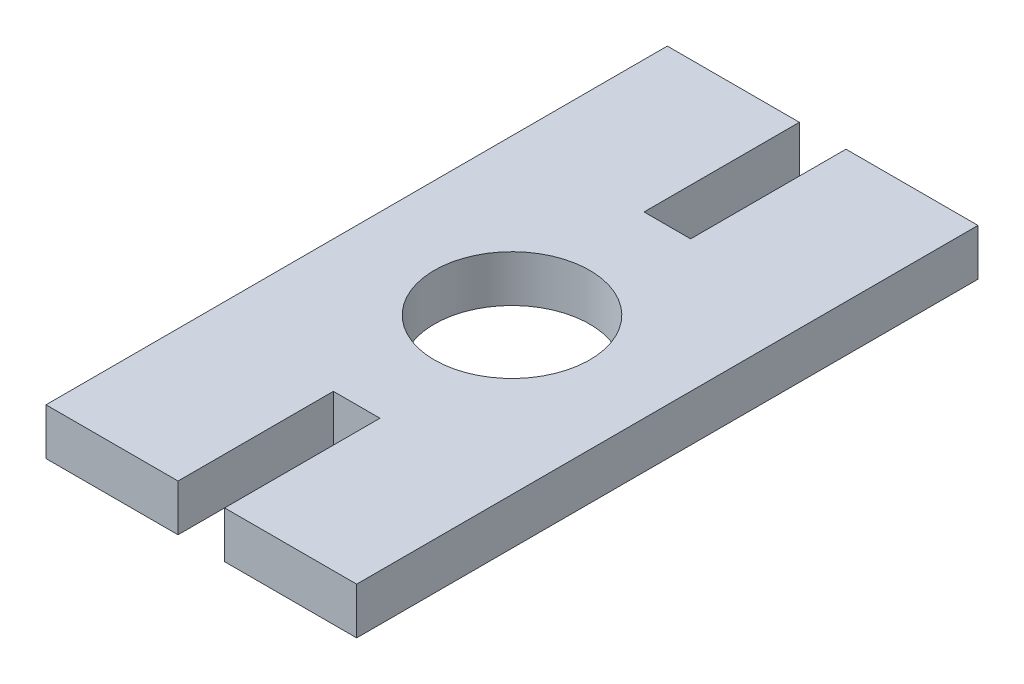
ISO-10303-21;
HEADER;
FILE_DESCRIPTION(('STEP AP214'),'2;1');
FILE_NAME('part.step','',(''),(''),'','','');
FILE_SCHEMA(('AUTOMOTIVE_DESIGN { 1 0 10303 214 1 1 1 1 }'));
ENDSEC;
DATA;
#1=APPLICATION_CONTEXT('core data for automotive mechanical design processes');
#2=APPLICATION_PROTOCOL_DEFINITION('international standard','automotive_design',2000,#1);
#3=PRODUCT_CONTEXT('',#1,'mechanical');
#4=PRODUCT('Part','Part','',(#3));
#5=PRODUCT_RELATED_PRODUCT_CATEGORY('part','',(#4));
#6=PRODUCT_DEFINITION_FORMATION('','',#4);
#7=PRODUCT_DEFINITION_CONTEXT('part definition',#1,'design');
#8=PRODUCT_DEFINITION('design','',#6,#7);
#9=PRODUCT_DEFINITION_SHAPE('','',#8);
#10=(LENGTH_UNIT() NAMED_UNIT(*) SI_UNIT(.MILLI.,.METRE.));
#11=(NAMED_UNIT(*) PLANE_ANGLE_UNIT() SI_UNIT($,.RADIAN.));
#12=(NAMED_UNIT(*) SI_UNIT($,.STERADIAN.) SOLID_ANGLE_UNIT());
#13=UNCERTAINTY_MEASURE_WITH_UNIT(LENGTH_MEASURE(1.E-05),#10,'distance_accuracy_value','');
#14=(GEOMETRIC_REPRESENTATION_CONTEXT(3) GLOBAL_UNCERTAINTY_ASSIGNED_CONTEXT((#13)) GLOBAL_UNIT_ASSIGNED_CONTEXT((#10,
#11,#12)) REPRESENTATION_CONTEXT('',''));
#15=CARTESIAN_POINT('',(0.,0.,0.));
#16=DIRECTION('',(0.,0.,1.));
#17=DIRECTION('',(1.,0.,0.));
#18=AXIS2_PLACEMENT_3D('',#15,#16,#17);
#19=CARTESIAN_POINT('',(1.5,3.,0.));
#20=DIRECTION('',(-1.,0.,0.));
#21=DIRECTION('',(0.,0.,1.));
#22=AXIS2_PLACEMENT_3D('',#19,#20,#21);
#23=PLANE('',#22);
#24=DIRECTION('',(0.,0.,-1.));
#25=VECTOR('',#24,1.);
#26=CARTESIAN_POINT('',(1.5,0.,0.));
#27=LINE('',#26,#25);
#28=CARTESIAN_POINT('',(1.5,0.,-9.99999999999999));
#29=VERTEX_POINT('',#28);
#30=CARTESIAN_POINT('',(1.5,0.,-20.));
#31=VERTEX_POINT('',#30);
#32=EDGE_CURVE('E188',#29,#31,#27,.T.);
#33=ORIENTED_EDGE('',*,*,#32,.F.);
#34=DIRECTION('',(0.,-1.,0.));
#35=VECTOR('',#34,1.);
#36=CARTESIAN_POINT('',(1.5,3.,-9.99999999999999));
#37=LINE('',#36,#35);
#38=CARTESIAN_POINT('',(1.5,3.,-9.99999999999999));
#39=VERTEX_POINT('',#38);
#40=EDGE_CURVE('E11',#39,#29,#37,.T.);
#41=ORIENTED_EDGE('',*,*,#40,.F.);
#42=DIRECTION('',(0.,0.,-1.));
#43=VECTOR('',#42,1.);
#44=CARTESIAN_POINT('',(1.5,3.,0.));
#45=LINE('',#44,#43);
#46=CARTESIAN_POINT('',(1.5,3.,-20.));
#47=VERTEX_POINT('',#46);
#48=EDGE_CURVE('E271',#39,#47,#45,.T.);
#49=ORIENTED_EDGE('',*,*,#48,.T.);
#50=DIRECTION('',(0.,-1.,0.));
#51=VECTOR('',#50,1.);
#52=CARTESIAN_POINT('',(1.5,3.,-20.));
#53=LINE('',#52,#51);
#54=EDGE_CURVE('E52',#47,#31,#53,.T.);
#55=ORIENTED_EDGE('',*,*,#54,.T.);
#56=EDGE_LOOP('',(#33,#41,#49,#55));
#57=FACE_BOUND('',#56,.T.);
#58=ADVANCED_FACE('F35',(#57),#23,.T.);
#59=CARTESIAN_POINT('',(0.,3.,-9.99999999999999));
#60=DIRECTION('',(0.,0.,-1.));
#61=DIRECTION('',(-1.,0.,0.));
#62=AXIS2_PLACEMENT_3D('',#59,#60,#61);
#63=PLANE('',#62);
#64=DIRECTION('',(1.,0.,0.));
#65=VECTOR('',#64,1.);
#66=CARTESIAN_POINT('',(0.,0.,-9.99999999999999));
#67=LINE('',#66,#65);
#68=CARTESIAN_POINT('',(-1.5,0.,-9.99999999999999));
#69=VERTEX_POINT('',#68);
#70=EDGE_CURVE('E182',#69,#29,#67,.T.);
#71=ORIENTED_EDGE('',*,*,#70,.F.);
#72=DIRECTION('',(0.,-1.,0.));
#73=VECTOR('',#72,1.);
#74=CARTESIAN_POINT('',(-1.5,3.,-9.99999999999999));
#75=LINE('',#74,#73);
#76=CARTESIAN_POINT('',(-1.5,3.,-9.99999999999999));
#77=VERTEX_POINT('',#76);
#78=EDGE_CURVE('E44',#77,#69,#75,.T.);
#79=ORIENTED_EDGE('',*,*,#78,.F.);
#80=DIRECTION('',(1.,0.,0.));
#81=VECTOR('',#80,1.);
#82=CARTESIAN_POINT('',(0.,3.,-9.99999999999999));
#83=LINE('',#82,#81);
#84=EDGE_CURVE('E273',#77,#39,#83,.T.);
#85=ORIENTED_EDGE('',*,*,#84,.T.);
#86=ORIENTED_EDGE('',*,*,#40,.T.);
#87=EDGE_LOOP('',(#71,#79,#85,#86));
#88=FACE_BOUND('',#87,.T.);
#89=ADVANCED_FACE('F187',(#88),#63,.T.);
#90=CARTESIAN_POINT('',(-1.5,3.,0.));
#91=DIRECTION('',(-1.,0.,0.));
#92=DIRECTION('',(0.,0.,1.));
#93=AXIS2_PLACEMENT_3D('',#90,#91,#92);
#94=PLANE('',#93);
#95=DIRECTION('',(0.,0.,-1.));
#96=VECTOR('',#95,1.);
#97=CARTESIAN_POINT('',(-1.5,0.,0.));
#98=LINE('',#97,#96);
#99=CARTESIAN_POINT('',(-1.5,0.,-20.));
#100=VERTEX_POINT('',#99);
#101=EDGE_CURVE('E172',#69,#100,#98,.T.);
#102=ORIENTED_EDGE('',*,*,#101,.T.);
#103=DIRECTION('',(0.,-1.,0.));
#104=VECTOR('',#103,1.);
#105=CARTESIAN_POINT('',(-1.5,3.,-20.));
#106=LINE('',#105,#104);
#107=CARTESIAN_POINT('',(-1.5,3.,-20.));
#108=VERTEX_POINT('',#107);
#109=EDGE_CURVE('E165',#108,#100,#106,.T.);
#110=ORIENTED_EDGE('',*,*,#109,.F.);
#111=DIRECTION('',(0.,0.,-1.));
#112=VECTOR('',#111,1.);
#113=CARTESIAN_POINT('',(-1.5,3.,0.));
#114=LINE('',#113,#112);
#115=EDGE_CURVE('E174',#77,#108,#114,.T.);
#116=ORIENTED_EDGE('',*,*,#115,.F.);
#117=ORIENTED_EDGE('',*,*,#78,.T.);
#118=EDGE_LOOP('',(#102,#110,#116,#117));
#119=FACE_BOUND('',#118,.T.);
#120=ADVANCED_FACE('F170',(#119),#94,.F.);
#121=CARTESIAN_POINT('',(0.,3.,-20.));
#122=DIRECTION('',(0.,0.,-1.));
#123=DIRECTION('',(-1.,0.,0.));
#124=AXIS2_PLACEMENT_3D('',#121,#122,#123);
#125=PLANE('',#124);
#126=DIRECTION('',(1.,0.,0.));
#127=VECTOR('',#126,1.);
#128=CARTESIAN_POINT('',(0.,0.,-20.));
#129=LINE('',#128,#127);
#130=CARTESIAN_POINT('',(-10.,0.,-20.));
#131=VERTEX_POINT('',#130);
#132=EDGE_CURVE('E185',#131,#100,#129,.T.);
#133=ORIENTED_EDGE('',*,*,#132,.F.);
#134=DIRECTION('',(0.,-1.,0.));
#135=VECTOR('',#134,1.);
#136=CARTESIAN_POINT('',(-10.,3.,-20.));
#137=LINE('',#136,#135);
#138=CARTESIAN_POINT('',(-10.,3.,-20.));
#139=VERTEX_POINT('',#138);
#140=EDGE_CURVE('E163',#139,#131,#137,.T.);
#141=ORIENTED_EDGE('',*,*,#140,.F.);
#142=DIRECTION('',(1.,0.,0.));
#143=VECTOR('',#142,1.);
#144=CARTESIAN_POINT('',(0.,3.,-20.));
#145=LINE('',#144,#143);
#146=EDGE_CURVE('E278',#139,#108,#145,.T.);
#147=ORIENTED_EDGE('',*,*,#146,.T.);
#148=ORIENTED_EDGE('',*,*,#109,.T.);
#149=EDGE_LOOP('',(#133,#141,#147,#148));
#150=FACE_BOUND('',#149,.T.);
#151=ADVANCED_FACE('F238',(#150),#125,.T.);
#152=CARTESIAN_POINT('',(-10.,3.,0.));
#153=DIRECTION('',(-1.,0.,0.));
#154=DIRECTION('',(0.,0.,1.));
#155=AXIS2_PLACEMENT_3D('',#152,#153,#154);
#156=PLANE('',#155);
#157=DIRECTION('',(0.,0.,-1.));
#158=VECTOR('',#157,1.);
#159=CARTESIAN_POINT('',(-10.,0.,0.));
#160=LINE('',#159,#158);
#161=CARTESIAN_POINT('',(-10.,0.,20.));
#162=VERTEX_POINT('',#161);
#163=EDGE_CURVE('E195',#162,#131,#160,.T.);
#164=ORIENTED_EDGE('',*,*,#163,.F.);
#165=DIRECTION('',(0.,-1.,0.));
#166=VECTOR('',#165,1.);
#167=CARTESIAN_POINT('',(-10.,3.,20.));
#168=LINE('',#167,#166);
#169=CARTESIAN_POINT('',(-10.,3.,20.));
#170=VERTEX_POINT('',#169);
#171=EDGE_CURVE('E161',#170,#162,#168,.T.);
#172=ORIENTED_EDGE('',*,*,#171,.F.);
#173=DIRECTION('',(0.,0.,-1.));
#174=VECTOR('',#173,1.);
#175=CARTESIAN_POINT('',(-10.,3.,0.));
#176=LINE('',#175,#174);
#177=EDGE_CURVE('E281',#170,#139,#176,.T.);
#178=ORIENTED_EDGE('',*,*,#177,.T.);
#179=ORIENTED_EDGE('',*,*,#140,.T.);
#180=EDGE_LOOP('',(#164,#172,#178,#179));
#181=FACE_BOUND('',#180,.T.);
#182=ADVANCED_FACE('F241',(#181),#156,.T.);
#183=CARTESIAN_POINT('',(0.,3.,20.));
#184=DIRECTION('',(0.,0.,-1.));
#185=DIRECTION('',(-1.,0.,0.));
#186=AXIS2_PLACEMENT_3D('',#183,#184,#185);
#187=PLANE('',#186);
#188=DIRECTION('',(1.,0.,0.));
#189=VECTOR('',#188,1.);
#190=CARTESIAN_POINT('',(0.,0.,20.));
#191=LINE('',#190,#189);
#192=CARTESIAN_POINT('',(-1.5,0.,20.));
#193=VERTEX_POINT('',#192);
#194=EDGE_CURVE('E197',#162,#193,#191,.T.);
#195=ORIENTED_EDGE('',*,*,#194,.T.);
#196=DIRECTION('',(0.,-1.,0.));
#197=VECTOR('',#196,1.);
#198=CARTESIAN_POINT('',(-1.5,3.,20.));
#199=LINE('',#198,#197);
#200=CARTESIAN_POINT('',(-1.5,3.,20.));
#201=VERTEX_POINT('',#200);
#202=EDGE_CURVE('E158',#201,#193,#199,.T.);
#203=ORIENTED_EDGE('',*,*,#202,.F.);
#204=DIRECTION('',(1.,0.,0.));
#205=VECTOR('',#204,1.);
#206=CARTESIAN_POINT('',(0.,3.,20.));
#207=LINE('',#206,#205);
#208=EDGE_CURVE('E284',#170,#201,#207,.T.);
#209=ORIENTED_EDGE('',*,*,#208,.F.);
#210=ORIENTED_EDGE('',*,*,#171,.T.);
#211=EDGE_LOOP('',(#195,#203,#209,#210));
#212=FACE_BOUND('',#211,.T.);
#213=ADVANCED_FACE('F245',(#212),#187,.F.);
#214=CARTESIAN_POINT('',(-1.5,3.,0.));
#215=DIRECTION('',(-1.,0.,0.));
#216=DIRECTION('',(0.,0.,1.));
#217=AXIS2_PLACEMENT_3D('',#214,#215,#216);
#218=PLANE('',#217);
#219=DIRECTION('',(0.,0.,-1.));
#220=VECTOR('',#219,1.);
#221=CARTESIAN_POINT('',(-1.5,0.,0.));
#222=LINE('',#221,#220);
#223=CARTESIAN_POINT('',(-1.5,0.,10.));
#224=VERTEX_POINT('',#223);
#225=EDGE_CURVE('E200',#193,#224,#222,.T.);
#226=ORIENTED_EDGE('',*,*,#225,.T.);
#227=DIRECTION('',(0.,-1.,0.));
#228=VECTOR('',#227,1.);
#229=CARTESIAN_POINT('',(-1.5,3.,10.));
#230=LINE('',#229,#228);
#231=CARTESIAN_POINT('',(-1.5,3.,10.));
#232=VERTEX_POINT('',#231);
#233=EDGE_CURVE('E155',#232,#224,#230,.T.);
#234=ORIENTED_EDGE('',*,*,#233,.F.);
#235=DIRECTION('',(0.,0.,-1.));
#236=VECTOR('',#235,1.);
#237=CARTESIAN_POINT('',(-1.5,3.,0.));
#238=LINE('',#237,#236);
#239=EDGE_CURVE('E287',#201,#232,#238,.T.);
#240=ORIENTED_EDGE('',*,*,#239,.F.);
#241=ORIENTED_EDGE('',*,*,#202,.T.);
#242=EDGE_LOOP('',(#226,#234,#240,#241));
#243=FACE_BOUND('',#242,.T.);
#244=ADVANCED_FACE('F249',(#243),#218,.F.);
#245=CARTESIAN_POINT('',(0.,3.,10.));
#246=DIRECTION('',(0.,0.,-1.));
#247=DIRECTION('',(-1.,0.,0.));
#248=AXIS2_PLACEMENT_3D('',#245,#246,#247);
#249=PLANE('',#248);
#250=DIRECTION('',(1.,0.,0.));
#251=VECTOR('',#250,1.);
#252=CARTESIAN_POINT('',(0.,0.,10.));
#253=LINE('',#252,#251);
#254=CARTESIAN_POINT('',(1.5,0.,10.));
#255=VERTEX_POINT('',#254);
#256=EDGE_CURVE('E203',#224,#255,#253,.T.);
#257=ORIENTED_EDGE('',*,*,#256,.T.);
#258=DIRECTION('',(0.,-1.,0.));
#259=VECTOR('',#258,1.);
#260=CARTESIAN_POINT('',(1.5,3.,10.));
#261=LINE('',#260,#259);
#262=CARTESIAN_POINT('',(1.5,3.,10.));
#263=VERTEX_POINT('',#262);
#264=EDGE_CURVE('E149',#263,#255,#261,.T.);
#265=ORIENTED_EDGE('',*,*,#264,.F.);
#266=DIRECTION('',(1.,0.,0.));
#267=VECTOR('',#266,1.);
#268=CARTESIAN_POINT('',(0.,3.,10.));
#269=LINE('',#268,#267);
#270=EDGE_CURVE('E290',#232,#263,#269,.T.);
#271=ORIENTED_EDGE('',*,*,#270,.F.);
#272=ORIENTED_EDGE('',*,*,#233,.T.);
#273=EDGE_LOOP('',(#257,#265,#271,#272));
#274=FACE_BOUND('',#273,.T.);
#275=ADVANCED_FACE('F253',(#274),#249,.F.);
#276=CARTESIAN_POINT('',(1.5,3.,0.));
#277=DIRECTION('',(-1.,0.,0.));
#278=DIRECTION('',(0.,0.,1.));
#279=AXIS2_PLACEMENT_3D('',#276,#277,#278);
#280=PLANE('',#279);
#281=DIRECTION('',(0.,0.,-1.));
#282=VECTOR('',#281,1.);
#283=CARTESIAN_POINT('',(1.5,0.,0.));
#284=LINE('',#283,#282);
#285=CARTESIAN_POINT('',(1.5,0.,20.));
#286=VERTEX_POINT('',#285);
#287=EDGE_CURVE('E206',#286,#255,#284,.T.);
#288=ORIENTED_EDGE('',*,*,#287,.F.);
#289=DIRECTION('',(0.,-1.,0.));
#290=VECTOR('',#289,1.);
#291=CARTESIAN_POINT('',(1.5,3.,20.));
#292=LINE('',#291,#290);
#293=CARTESIAN_POINT('',(1.5,3.,20.));
#294=VERTEX_POINT('',#293);
#295=EDGE_CURVE('E147',#294,#286,#292,.T.);
#296=ORIENTED_EDGE('',*,*,#295,.F.);
#297=DIRECTION('',(0.,0.,-1.));
#298=VECTOR('',#297,1.);
#299=CARTESIAN_POINT('',(1.5,3.,0.));
#300=LINE('',#299,#298);
#301=EDGE_CURVE('E141',#294,#263,#300,.T.);
#302=ORIENTED_EDGE('',*,*,#301,.T.);
#303=ORIENTED_EDGE('',*,*,#264,.T.);
#304=EDGE_LOOP('',(#288,#296,#302,#303));
#305=FACE_BOUND('',#304,.T.);
#306=ADVANCED_FACE('F257',(#305),#280,.T.);
#307=CARTESIAN_POINT('',(0.,3.,20.));
#308=DIRECTION('',(0.,0.,-1.));
#309=DIRECTION('',(-1.,0.,0.));
#310=AXIS2_PLACEMENT_3D('',#307,#308,#309);
#311=PLANE('',#310);
#312=DIRECTION('',(1.,0.,0.));
#313=VECTOR('',#312,1.);
#314=CARTESIAN_POINT('',(0.,0.,20.));
#315=LINE('',#314,#313);
#316=CARTESIAN_POINT('',(10.,0.,20.));
#317=VERTEX_POINT('',#316);
#318=EDGE_CURVE('E146',#286,#317,#315,.T.);
#319=ORIENTED_EDGE('',*,*,#318,.T.);
#320=DIRECTION('',(0.,-1.,0.));
#321=VECTOR('',#320,1.);
#322=CARTESIAN_POINT('',(10.,3.,20.));
#323=LINE('',#322,#321);
#324=CARTESIAN_POINT('',(10.,3.,20.));
#325=VERTEX_POINT('',#324);
#326=EDGE_CURVE('E130',#325,#317,#323,.T.);
#327=ORIENTED_EDGE('',*,*,#326,.F.);
#328=DIRECTION('',(1.,0.,0.));
#329=VECTOR('',#328,1.);
#330=CARTESIAN_POINT('',(0.,3.,20.));
#331=LINE('',#330,#329);
#332=EDGE_CURVE('E135',#294,#325,#331,.T.);
#333=ORIENTED_EDGE('',*,*,#332,.F.);
#334=ORIENTED_EDGE('',*,*,#295,.T.);
#335=EDGE_LOOP('',(#319,#327,#333,#334));
#336=FACE_BOUND('',#335,.T.);
#337=ADVANCED_FACE('F144',(#336),#311,.F.);
#338=CARTESIAN_POINT('',(10.,3.,0.));
#339=DIRECTION('',(-1.,0.,0.));
#340=DIRECTION('',(0.,0.,1.));
#341=AXIS2_PLACEMENT_3D('',#338,#339,#340);
#342=PLANE('',#341);
#343=DIRECTION('',(0.,0.,-1.));
#344=VECTOR('',#343,1.);
#345=CARTESIAN_POINT('',(10.,0.,0.));
#346=LINE('',#345,#344);
#347=CARTESIAN_POINT('',(10.,0.,-20.));
#348=VERTEX_POINT('',#347);
#349=EDGE_CURVE('E210',#317,#348,#346,.T.);
#350=ORIENTED_EDGE('',*,*,#349,.T.);
#351=DIRECTION('',(0.,-1.,0.));
#352=VECTOR('',#351,1.);
#353=CARTESIAN_POINT('',(10.,3.,-20.));
#354=LINE('',#353,#352);
#355=CARTESIAN_POINT('',(10.,3.,-20.));
#356=VERTEX_POINT('',#355);
#357=EDGE_CURVE('E90',#356,#348,#354,.T.);
#358=ORIENTED_EDGE('',*,*,#357,.F.);
#359=DIRECTION('',(0.,0.,-1.));
#360=VECTOR('',#359,1.);
#361=CARTESIAN_POINT('',(10.,3.,0.));
#362=LINE('',#361,#360);
#363=EDGE_CURVE('E126',#325,#356,#362,.T.);
#364=ORIENTED_EDGE('',*,*,#363,.F.);
#365=ORIENTED_EDGE('',*,*,#326,.T.);
#366=EDGE_LOOP('',(#350,#358,#364,#365));
#367=FACE_BOUND('',#366,.T.);
#368=ADVANCED_FACE('F128',(#367),#342,.F.);
#369=CARTESIAN_POINT('',(0.,3.,0.));
#370=DIRECTION('',(0.,-1.,0.));
#371=DIRECTION('',(0.,0.,-1.));
#372=AXIS2_PLACEMENT_3D('',#369,#370,#371);
#373=CYLINDRICAL_SURFACE('',#372,5.);
#374=CARTESIAN_POINT('',(0.,3.,0.));
#375=DIRECTION('',(0.,1.,0.));
#376=DIRECTION('',(0.,0.,1.));
#377=AXIS2_PLACEMENT_3D('',#374,#375,#376);
#378=CIRCLE('',#377,5.);
#379=CARTESIAN_POINT('',(0.,3.,5.));
#380=VERTEX_POINT('',#379);
#381=EDGE_CURVE('E214',#380,#380,#378,.T.);
#382=ORIENTED_EDGE('',*,*,#381,.T.);
#383=EDGE_LOOP('',(#382));
#384=FACE_BOUND('',#383,.T.);
#385=CARTESIAN_POINT('',(0.,0.,0.));
#386=DIRECTION('',(0.,1.,0.));
#387=DIRECTION('',(0.,0.,1.));
#388=AXIS2_PLACEMENT_3D('',#385,#386,#387);
#389=CIRCLE('',#388,5.);
#390=CARTESIAN_POINT('',(0.,0.,5.));
#391=VERTEX_POINT('',#390);
#392=EDGE_CURVE('E190',#391,#391,#389,.T.);
#393=ORIENTED_EDGE('',*,*,#392,.F.);
#394=EDGE_LOOP('',(#393));
#395=FACE_BOUND('',#394,.T.);
#396=ADVANCED_FACE('F37',(#384,#395),#373,.F.);
#397=CARTESIAN_POINT('',(0.,3.,-20.));
#398=DIRECTION('',(0.,0.,-1.));
#399=DIRECTION('',(-1.,0.,0.));
#400=AXIS2_PLACEMENT_3D('',#397,#398,#399);
#401=PLANE('',#400);
#402=DIRECTION('',(1.,0.,0.));
#403=VECTOR('',#402,1.);
#404=CARTESIAN_POINT('',(0.,0.,-20.));
#405=LINE('',#404,#403);
#406=EDGE_CURVE('E212',#31,#348,#405,.T.);
#407=ORIENTED_EDGE('',*,*,#406,.F.);
#408=ORIENTED_EDGE('',*,*,#54,.F.);
#409=DIRECTION('',(1.,0.,0.));
#410=VECTOR('',#409,1.);
#411=CARTESIAN_POINT('',(0.,3.,-20.));
#412=LINE('',#411,#410);
#413=EDGE_CURVE('E134',#47,#356,#412,.T.);
#414=ORIENTED_EDGE('',*,*,#413,.T.);
#415=ORIENTED_EDGE('',*,*,#357,.T.);
#416=EDGE_LOOP('',(#407,#408,#414,#415));
#417=FACE_BOUND('',#416,.T.);
#418=ADVANCED_FACE('F221',(#417),#401,.T.);
#419=CARTESIAN_POINT('',(0.,3.,0.));
#420=DIRECTION('',(0.,1.,0.));
#421=DIRECTION('',(0.,0.,1.));
#422=AXIS2_PLACEMENT_3D('',#419,#420,#421);
#423=PLANE('',#422);
#424=ORIENTED_EDGE('',*,*,#381,.F.);
#425=EDGE_LOOP('',(#424));
#426=FACE_BOUND('',#425,.T.);
#427=ORIENTED_EDGE('',*,*,#48,.F.);
#428=ORIENTED_EDGE('',*,*,#84,.F.);
#429=ORIENTED_EDGE('',*,*,#115,.T.);
#430=ORIENTED_EDGE('',*,*,#146,.F.);
#431=ORIENTED_EDGE('',*,*,#177,.F.);
#432=ORIENTED_EDGE('',*,*,#208,.T.);
#433=ORIENTED_EDGE('',*,*,#239,.T.);
#434=ORIENTED_EDGE('',*,*,#270,.T.);
#435=ORIENTED_EDGE('',*,*,#301,.F.);
#436=ORIENTED_EDGE('',*,*,#332,.T.);
#437=ORIENTED_EDGE('',*,*,#363,.T.);
#438=ORIENTED_EDGE('',*,*,#413,.F.);
#439=EDGE_LOOP('',(#427,#428,#429,#430,#431,#432,#433,#434,#435,#436,#437,#438));
#440=FACE_BOUND('',#439,.T.);
#441=ADVANCED_FACE('F139',(#426,#440),#423,.T.);
#442=CARTESIAN_POINT('',(0.,0.,0.));
#443=DIRECTION('',(0.,1.,0.));
#444=DIRECTION('',(0.,0.,1.));
#445=AXIS2_PLACEMENT_3D('',#442,#443,#444);
#446=PLANE('',#445);
#447=ORIENTED_EDGE('',*,*,#392,.T.);
#448=EDGE_LOOP('',(#447));
#449=FACE_BOUND('',#448,.T.);
#450=ORIENTED_EDGE('',*,*,#32,.T.);
#451=ORIENTED_EDGE('',*,*,#406,.T.);
#452=ORIENTED_EDGE('',*,*,#349,.F.);
#453=ORIENTED_EDGE('',*,*,#318,.F.);
#454=ORIENTED_EDGE('',*,*,#287,.T.);
#455=ORIENTED_EDGE('',*,*,#256,.F.);
#456=ORIENTED_EDGE('',*,*,#225,.F.);
#457=ORIENTED_EDGE('',*,*,#194,.F.);
#458=ORIENTED_EDGE('',*,*,#163,.T.);
#459=ORIENTED_EDGE('',*,*,#132,.T.);
#460=ORIENTED_EDGE('',*,*,#101,.F.);
#461=ORIENTED_EDGE('',*,*,#70,.T.);
#462=EDGE_LOOP('',(#450,#451,#452,#453,#454,#455,#456,#457,#458,#459,#460,#461));
#463=FACE_BOUND('',#462,.T.);
#464=ADVANCED_FACE('F181',(#449,#463),#446,.F.);
#465=CLOSED_SHELL('',(#58,#89,#120,#151,#182,#213,#244,#275,#306,#337,#368,#396,#418,#441,#464));
#466=MANIFOLD_SOLID_BREP('B2',#465);
#467=ADVANCED_BREP_SHAPE_REPRESENTATION('',(#18,#466),#14);
#468=SHAPE_DEFINITION_REPRESENTATION(#9,#467);
ENDSEC;
END-ISO-10303-21;
